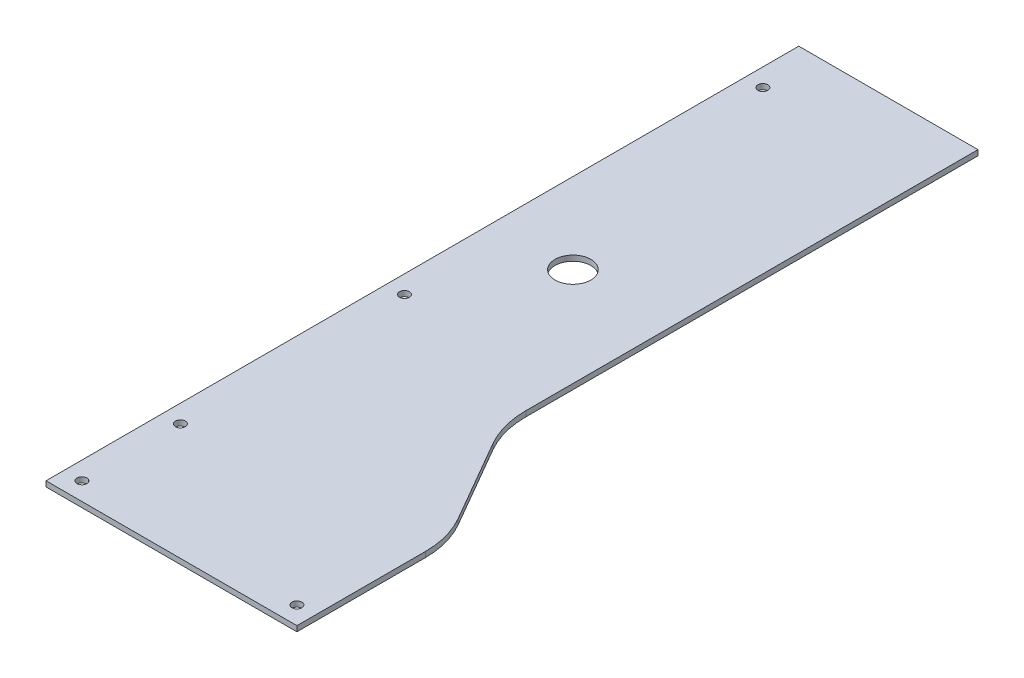
ISO-10303-21;
HEADER;
FILE_DESCRIPTION(('STEP AP214'),'2;1');
FILE_NAME('part.step','',(''),(''),'','','');
FILE_SCHEMA(('AUTOMOTIVE_DESIGN { 1 0 10303 214 1 1 1 1 }'));
ENDSEC;
DATA;
#1=APPLICATION_CONTEXT('core data for automotive mechanical design processes');
#2=APPLICATION_PROTOCOL_DEFINITION('international standard','automotive_design',2000,#1);
#3=PRODUCT_CONTEXT('',#1,'mechanical');
#4=PRODUCT('Part','Part','',(#3));
#5=PRODUCT_RELATED_PRODUCT_CATEGORY('part','',(#4));
#6=PRODUCT_DEFINITION_FORMATION('','',#4);
#7=PRODUCT_DEFINITION_CONTEXT('part definition',#1,'design');
#8=PRODUCT_DEFINITION('design','',#6,#7);
#9=PRODUCT_DEFINITION_SHAPE('','',#8);
#10=(LENGTH_UNIT() NAMED_UNIT(*) SI_UNIT(.MILLI.,.METRE.));
#11=(NAMED_UNIT(*) PLANE_ANGLE_UNIT() SI_UNIT($,.RADIAN.));
#12=(NAMED_UNIT(*) SI_UNIT($,.STERADIAN.) SOLID_ANGLE_UNIT());
#13=UNCERTAINTY_MEASURE_WITH_UNIT(LENGTH_MEASURE(1.E-05),#10,'distance_accuracy_value','');
#14=(GEOMETRIC_REPRESENTATION_CONTEXT(3) GLOBAL_UNCERTAINTY_ASSIGNED_CONTEXT((#13)) GLOBAL_UNIT_ASSIGNED_CONTEXT((#10,
#11,#12)) REPRESENTATION_CONTEXT('',''));
#15=CARTESIAN_POINT('',(0.,0.,0.));
#16=DIRECTION('',(0.,0.,1.));
#17=DIRECTION('',(1.,0.,0.));
#18=AXIS2_PLACEMENT_3D('',#15,#16,#17);
#19=CARTESIAN_POINT('',(204.268453609589,39.4297055458415,282.959032092008));
#20=DIRECTION('',(0.,1.,0.));
#21=DIRECTION('',(1.,0.,0.));
#22=AXIS2_PLACEMENT_3D('',#19,#20,#21);
#23=CYLINDRICAL_SURFACE('',#22,2.75);
#24=CARTESIAN_POINT('',(204.268453609589,39.4297055458415,282.959032092008));
#25=DIRECTION('',(0.,-1.,0.));
#26=DIRECTION('',(-1.,0.,0.));
#27=AXIS2_PLACEMENT_3D('',#24,#25,#26);
#28=CIRCLE('',#27,2.75);
#29=CARTESIAN_POINT('',(201.518453609589,39.4297055458415,282.959032092008));
#30=VERTEX_POINT('',#29);
#31=EDGE_CURVE('E194',#30,#30,#28,.T.);
#32=ORIENTED_EDGE('',*,*,#31,.T.);
#33=EDGE_LOOP('',(#32));
#34=FACE_BOUND('',#33,.T.);
#35=CARTESIAN_POINT('',(204.268453609589,42.4297055458415,282.959032092008));
#36=DIRECTION('',(0.,-1.,0.));
#37=DIRECTION('',(-1.,0.,0.));
#38=AXIS2_PLACEMENT_3D('',#35,#36,#37);
#39=CIRCLE('',#38,2.75);
#40=CARTESIAN_POINT('',(201.518453609589,42.4297055458415,282.959032092008));
#41=VERTEX_POINT('',#40);
#42=EDGE_CURVE('E198',#41,#41,#39,.T.);
#43=ORIENTED_EDGE('',*,*,#42,.F.);
#44=EDGE_LOOP('',(#43));
#45=FACE_BOUND('',#44,.T.);
#46=ADVANCED_FACE('F17',(#34,#45),#23,.F.);
#47=CARTESIAN_POINT('',(84.2684536095885,39.4297055458415,282.959032092008));
#48=DIRECTION('',(0.,1.,0.));
#49=DIRECTION('',(1.,0.,0.));
#50=AXIS2_PLACEMENT_3D('',#47,#48,#49);
#51=CYLINDRICAL_SURFACE('',#50,2.75);
#52=CARTESIAN_POINT('',(84.2684536095885,39.4297055458415,282.959032092008));
#53=DIRECTION('',(0.,-1.,0.));
#54=DIRECTION('',(-1.,0.,0.));
#55=AXIS2_PLACEMENT_3D('',#52,#53,#54);
#56=CIRCLE('',#55,2.75);
#57=CARTESIAN_POINT('',(81.5184536095885,39.4297055458415,282.959032092008));
#58=VERTEX_POINT('',#57);
#59=EDGE_CURVE('E186',#58,#58,#56,.T.);
#60=ORIENTED_EDGE('',*,*,#59,.T.);
#61=EDGE_LOOP('',(#60));
#62=FACE_BOUND('',#61,.T.);
#63=CARTESIAN_POINT('',(84.2684536095885,42.4297055458415,282.959032092008));
#64=DIRECTION('',(0.,-1.,0.));
#65=DIRECTION('',(-1.,0.,0.));
#66=AXIS2_PLACEMENT_3D('',#63,#64,#65);
#67=CIRCLE('',#66,2.75);
#68=CARTESIAN_POINT('',(81.5184536095885,42.4297055458415,282.959032092008));
#69=VERTEX_POINT('',#68);
#70=EDGE_CURVE('E190',#69,#69,#67,.T.);
#71=ORIENTED_EDGE('',*,*,#70,.F.);
#72=EDGE_LOOP('',(#71));
#73=FACE_BOUND('',#72,.T.);
#74=ADVANCED_FACE('F236',(#62,#73),#51,.F.);
#75=CARTESIAN_POINT('',(84.2684536095885,39.4297055458415,227.959032092009));
#76=DIRECTION('',(0.,1.,0.));
#77=DIRECTION('',(1.,0.,0.));
#78=AXIS2_PLACEMENT_3D('',#75,#76,#77);
#79=CYLINDRICAL_SURFACE('',#78,2.75);
#80=CARTESIAN_POINT('',(84.2684536095885,39.4297055458415,227.959032092009));
#81=DIRECTION('',(0.,-1.,0.));
#82=DIRECTION('',(-1.,0.,0.));
#83=AXIS2_PLACEMENT_3D('',#80,#81,#82);
#84=CIRCLE('',#83,2.75);
#85=CARTESIAN_POINT('',(81.5184536095885,39.4297055458415,227.959032092009));
#86=VERTEX_POINT('',#85);
#87=EDGE_CURVE('E178',#86,#86,#84,.T.);
#88=ORIENTED_EDGE('',*,*,#87,.T.);
#89=EDGE_LOOP('',(#88));
#90=FACE_BOUND('',#89,.T.);
#91=CARTESIAN_POINT('',(84.2684536095885,42.4297055458415,227.959032092009));
#92=DIRECTION('',(0.,-1.,0.));
#93=DIRECTION('',(-1.,0.,0.));
#94=AXIS2_PLACEMENT_3D('',#91,#92,#93);
#95=CIRCLE('',#94,2.75);
#96=CARTESIAN_POINT('',(81.5184536095885,42.4297055458415,227.959032092009));
#97=VERTEX_POINT('',#96);
#98=EDGE_CURVE('E182',#97,#97,#95,.T.);
#99=ORIENTED_EDGE('',*,*,#98,.F.);
#100=EDGE_LOOP('',(#99));
#101=FACE_BOUND('',#100,.T.);
#102=ADVANCED_FACE('F233',(#90,#101),#79,.F.);
#103=CARTESIAN_POINT('',(84.2684536095885,39.4297055458415,102.959032092009));
#104=DIRECTION('',(0.,1.,0.));
#105=DIRECTION('',(1.,0.,0.));
#106=AXIS2_PLACEMENT_3D('',#103,#104,#105);
#107=CYLINDRICAL_SURFACE('',#106,2.75);
#108=CARTESIAN_POINT('',(84.2684536095885,39.4297055458415,102.959032092009));
#109=DIRECTION('',(0.,-1.,0.));
#110=DIRECTION('',(-1.,0.,0.));
#111=AXIS2_PLACEMENT_3D('',#108,#109,#110);
#112=CIRCLE('',#111,2.75);
#113=CARTESIAN_POINT('',(81.5184536095885,39.4297055458415,102.959032092009));
#114=VERTEX_POINT('',#113);
#115=EDGE_CURVE('E170',#114,#114,#112,.T.);
#116=ORIENTED_EDGE('',*,*,#115,.T.);
#117=EDGE_LOOP('',(#116));
#118=FACE_BOUND('',#117,.T.);
#119=CARTESIAN_POINT('',(84.2684536095885,42.4297055458415,102.959032092009));
#120=DIRECTION('',(0.,-1.,0.));
#121=DIRECTION('',(-1.,0.,0.));
#122=AXIS2_PLACEMENT_3D('',#119,#120,#121);
#123=CIRCLE('',#122,2.75);
#124=CARTESIAN_POINT('',(81.5184536095885,42.4297055458415,102.959032092009));
#125=VERTEX_POINT('',#124);
#126=EDGE_CURVE('E174',#125,#125,#123,.T.);
#127=ORIENTED_EDGE('',*,*,#126,.F.);
#128=EDGE_LOOP('',(#127));
#129=FACE_BOUND('',#128,.T.);
#130=ADVANCED_FACE('F235',(#118,#129),#107,.F.);
#131=CARTESIAN_POINT('',(84.2684536095885,39.4297055458415,-97.0409679079914));
#132=DIRECTION('',(0.,1.,0.));
#133=DIRECTION('',(1.,0.,0.));
#134=AXIS2_PLACEMENT_3D('',#131,#132,#133);
#135=CYLINDRICAL_SURFACE('',#134,2.75000000000004);
#136=CARTESIAN_POINT('',(84.2684536095885,39.4297055458415,-97.0409679079914));
#137=DIRECTION('',(0.,-1.,0.));
#138=DIRECTION('',(-1.,0.,0.));
#139=AXIS2_PLACEMENT_3D('',#136,#137,#138);
#140=CIRCLE('',#139,2.75000000000004);
#141=CARTESIAN_POINT('',(81.5184536095885,39.4297055458415,-97.0409679079914));
#142=VERTEX_POINT('',#141);
#143=EDGE_CURVE('E150',#142,#142,#140,.T.);
#144=ORIENTED_EDGE('',*,*,#143,.T.);
#145=EDGE_LOOP('',(#144));
#146=FACE_BOUND('',#145,.T.);
#147=CARTESIAN_POINT('',(84.2684536095885,42.4297055458415,-97.0409679079914));
#148=DIRECTION('',(0.,-1.,0.));
#149=DIRECTION('',(-1.,0.,0.));
#150=AXIS2_PLACEMENT_3D('',#147,#148,#149);
#151=CIRCLE('',#150,2.75000000000004);
#152=CARTESIAN_POINT('',(81.5184536095885,42.4297055458415,-97.0409679079914));
#153=VERTEX_POINT('',#152);
#154=EDGE_CURVE('E166',#153,#153,#151,.T.);
#155=ORIENTED_EDGE('',*,*,#154,.F.);
#156=EDGE_LOOP('',(#155));
#157=FACE_BOUND('',#156,.T.);
#158=ADVANCED_FACE('F245',(#146,#157),#135,.F.);
#159=CARTESIAN_POINT('',(214.268453609588,39.4297055458415,292.959032092008));
#160=DIRECTION('',(0.,0.,-1.));
#161=DIRECTION('',(1.,0.,0.));
#162=AXIS2_PLACEMENT_3D('',#159,#160,#161);
#163=PLANE('',#162);
#164=DIRECTION('',(0.,1.,0.));
#165=VECTOR('',#164,1.);
#166=CARTESIAN_POINT('',(214.268453609588,39.4297055458415,292.959032092008));
#167=LINE('',#166,#165);
#168=CARTESIAN_POINT('',(214.268453609588,39.4297055458415,292.959032092008));
#169=VERTEX_POINT('',#168);
#170=CARTESIAN_POINT('',(214.268453609588,42.4297055458415,292.959032092008));
#171=VERTEX_POINT('',#170);
#172=EDGE_CURVE('E124',#169,#171,#167,.T.);
#173=ORIENTED_EDGE('',*,*,#172,.T.);
#174=DIRECTION('',(-1.,0.,0.));
#175=VECTOR('',#174,1.);
#176=CARTESIAN_POINT('',(214.268453609588,42.4297055458415,292.959032092008));
#177=LINE('',#176,#175);
#178=CARTESIAN_POINT('',(74.2684536095886,42.4297055458415,292.959032092008));
#179=VERTEX_POINT('',#178);
#180=EDGE_CURVE('E11',#171,#179,#177,.T.);
#181=ORIENTED_EDGE('',*,*,#180,.T.);
#182=DIRECTION('',(0.,1.,0.));
#183=VECTOR('',#182,1.);
#184=CARTESIAN_POINT('',(74.2684536095886,39.4297055458415,292.959032092008));
#185=LINE('',#184,#183);
#186=CARTESIAN_POINT('',(74.2684536095886,39.4297055458415,292.959032092008));
#187=VERTEX_POINT('',#186);
#188=EDGE_CURVE('E128',#187,#179,#185,.T.);
#189=ORIENTED_EDGE('',*,*,#188,.F.);
#190=DIRECTION('',(-1.,0.,0.));
#191=VECTOR('',#190,1.);
#192=CARTESIAN_POINT('',(214.268453609588,39.4297055458415,292.959032092008));
#193=LINE('',#192,#191);
#194=EDGE_CURVE('E95',#169,#187,#193,.T.);
#195=ORIENTED_EDGE('',*,*,#194,.F.);
#196=EDGE_LOOP('',(#173,#181,#189,#195));
#197=FACE_BOUND('',#196,.T.);
#198=ADVANCED_FACE('F19',(#197),#163,.F.);
#199=CARTESIAN_POINT('',(214.268453609588,39.4297055458415,221.356491713565));
#200=DIRECTION('',(-1.,0.,0.));
#201=DIRECTION('',(0.,0.,-1.));
#202=AXIS2_PLACEMENT_3D('',#199,#200,#201);
#203=PLANE('',#202);
#204=DIRECTION('',(0.,0.,1.));
#205=VECTOR('',#204,1.);
#206=CARTESIAN_POINT('',(214.268453609588,42.4297055458415,221.356491713565));
#207=LINE('',#206,#205);
#208=CARTESIAN_POINT('',(214.268453609588,42.4297055458415,221.356491713565));
#209=VERTEX_POINT('',#208);
#210=EDGE_CURVE('E98',#209,#171,#207,.T.);
#211=ORIENTED_EDGE('',*,*,#210,.T.);
#212=ORIENTED_EDGE('',*,*,#172,.F.);
#213=DIRECTION('',(0.,0.,1.));
#214=VECTOR('',#213,1.);
#215=CARTESIAN_POINT('',(214.268453609588,39.4297055458415,221.356491713565));
#216=LINE('',#215,#214);
#217=CARTESIAN_POINT('',(214.268453609588,39.4297055458415,221.356491713565));
#218=VERTEX_POINT('',#217);
#219=EDGE_CURVE('E153',#218,#169,#216,.T.);
#220=ORIENTED_EDGE('',*,*,#219,.F.);
#221=DIRECTION('',(0.,1.,0.));
#222=VECTOR('',#221,1.);
#223=CARTESIAN_POINT('',(214.268453609588,39.4297055458415,221.356491713565));
#224=LINE('',#223,#222);
#225=EDGE_CURVE('E120',#218,#209,#224,.T.);
#226=ORIENTED_EDGE('',*,*,#225,.T.);
#227=EDGE_LOOP('',(#211,#212,#220,#226));
#228=FACE_BOUND('',#227,.T.);
#229=ADVANCED_FACE('F261',(#228),#203,.F.);
#230=CARTESIAN_POINT('',(164.268453609589,39.4297055458415,221.356491713565));
#231=DIRECTION('',(0.,1.,0.));
#232=DIRECTION('',(1.,0.,0.));
#233=AXIS2_PLACEMENT_3D('',#230,#231,#232);
#234=CYLINDRICAL_SURFACE('',#233,50.);
#235=CARTESIAN_POINT('',(164.268453609589,42.4297055458415,221.356491713565));
#236=DIRECTION('',(0.,-1.,0.));
#237=DIRECTION('',(1.,0.,0.));
#238=AXIS2_PLACEMENT_3D('',#235,#236,#237);
#239=CIRCLE('',#238,50.);
#240=CARTESIAN_POINT('',(207.56972379881,42.4297055458415,196.356491713565));
#241=VERTEX_POINT('',#240);
#242=EDGE_CURVE('E134',#241,#209,#239,.T.);
#243=ORIENTED_EDGE('',*,*,#242,.T.);
#244=ORIENTED_EDGE('',*,*,#225,.F.);
#245=CARTESIAN_POINT('',(164.268453609589,39.4297055458415,221.356491713565));
#246=DIRECTION('',(0.,-1.,0.));
#247=DIRECTION('',(1.,0.,0.));
#248=AXIS2_PLACEMENT_3D('',#245,#246,#247);
#249=CIRCLE('',#248,50.);
#250=CARTESIAN_POINT('',(207.56972379881,39.4297055458415,196.356491713565));
#251=VERTEX_POINT('',#250);
#252=EDGE_CURVE('E156',#251,#218,#249,.T.);
#253=ORIENTED_EDGE('',*,*,#252,.F.);
#254=DIRECTION('',(0.,1.,0.));
#255=VECTOR('',#254,1.);
#256=CARTESIAN_POINT('',(207.56972379881,39.4297055458415,196.356491713565));
#257=LINE('',#256,#255);
#258=EDGE_CURVE('E116',#251,#241,#257,.T.);
#259=ORIENTED_EDGE('',*,*,#258,.T.);
#260=EDGE_LOOP('',(#243,#244,#253,#259));
#261=FACE_BOUND('',#260,.T.);
#262=ADVANCED_FACE('F257',(#261),#234,.T.);
#263=CARTESIAN_POINT('',(180.967183420366,39.4297055458415,150.279540167697));
#264=DIRECTION('',(-0.866025403784438,0.,0.5));
#265=DIRECTION('',(-0.5,0.,-0.866025403784438));
#266=AXIS2_PLACEMENT_3D('',#263,#264,#265);
#267=PLANE('',#266);
#268=DIRECTION('',(0.5,0.,0.866025403784438));
#269=VECTOR('',#268,1.);
#270=CARTESIAN_POINT('',(180.967183420366,42.4297055458415,150.279540167697));
#271=LINE('',#270,#269);
#272=CARTESIAN_POINT('',(180.967183420366,42.4297055458415,150.279540167697));
#273=VERTEX_POINT('',#272);
#274=EDGE_CURVE('E137',#273,#241,#271,.T.);
#275=ORIENTED_EDGE('',*,*,#274,.T.);
#276=ORIENTED_EDGE('',*,*,#258,.F.);
#277=DIRECTION('',(0.5,0.,0.866025403784438));
#278=VECTOR('',#277,1.);
#279=CARTESIAN_POINT('',(180.967183420366,39.4297055458415,150.279540167697));
#280=LINE('',#279,#278);
#281=CARTESIAN_POINT('',(180.967183420366,39.4297055458415,150.279540167697));
#282=VERTEX_POINT('',#281);
#283=EDGE_CURVE('E159',#282,#251,#280,.T.);
#284=ORIENTED_EDGE('',*,*,#283,.F.);
#285=DIRECTION('',(0.,1.,0.));
#286=VECTOR('',#285,1.);
#287=CARTESIAN_POINT('',(180.967183420366,39.4297055458415,150.279540167697));
#288=LINE('',#287,#286);
#289=EDGE_CURVE('E113',#282,#273,#288,.T.);
#290=ORIENTED_EDGE('',*,*,#289,.T.);
#291=EDGE_LOOP('',(#275,#276,#284,#290));
#292=FACE_BOUND('',#291,.T.);
#293=ADVANCED_FACE('F260',(#292),#267,.F.);
#294=CARTESIAN_POINT('',(224.268453609589,39.4297055458415,125.279540167697));
#295=DIRECTION('',(0.,1.,0.));
#296=DIRECTION('',(1.,0.,0.));
#297=AXIS2_PLACEMENT_3D('',#294,#295,#296);
#298=CYLINDRICAL_SURFACE('',#297,50.);
#299=CARTESIAN_POINT('',(224.268453609589,42.4297055458415,125.279540167697));
#300=DIRECTION('',(0.,1.,0.));
#301=DIRECTION('',(-1.,0.,0.));
#302=AXIS2_PLACEMENT_3D('',#299,#300,#301);
#303=CIRCLE('',#302,50.);
#304=CARTESIAN_POINT('',(174.268453609589,42.4297055458415,125.279540167698));
#305=VERTEX_POINT('',#304);
#306=EDGE_CURVE('E140',#305,#273,#303,.T.);
#307=ORIENTED_EDGE('',*,*,#306,.T.);
#308=ORIENTED_EDGE('',*,*,#289,.F.);
#309=CARTESIAN_POINT('',(224.268453609589,39.4297055458415,125.279540167697));
#310=DIRECTION('',(0.,1.,0.));
#311=DIRECTION('',(-1.,0.,0.));
#312=AXIS2_PLACEMENT_3D('',#309,#310,#311);
#313=CIRCLE('',#312,50.);
#314=CARTESIAN_POINT('',(174.268453609589,39.4297055458415,125.279540167698));
#315=VERTEX_POINT('',#314);
#316=EDGE_CURVE('E162',#315,#282,#313,.T.);
#317=ORIENTED_EDGE('',*,*,#316,.F.);
#318=DIRECTION('',(0.,1.,0.));
#319=VECTOR('',#318,1.);
#320=CARTESIAN_POINT('',(174.268453609589,39.4297055458415,125.279540167698));
#321=LINE('',#320,#319);
#322=EDGE_CURVE('E107',#315,#305,#321,.T.);
#323=ORIENTED_EDGE('',*,*,#322,.T.);
#324=EDGE_LOOP('',(#307,#308,#317,#323));
#325=FACE_BOUND('',#324,.T.);
#326=ADVANCED_FACE('F265',(#325),#298,.F.);
#327=CARTESIAN_POINT('',(174.268453609589,39.4297055458415,-127.040967907991));
#328=DIRECTION('',(-1.,0.,0.));
#329=DIRECTION('',(0.,0.,-1.));
#330=AXIS2_PLACEMENT_3D('',#327,#328,#329);
#331=PLANE('',#330);
#332=DIRECTION('',(0.,0.,1.));
#333=VECTOR('',#332,1.);
#334=CARTESIAN_POINT('',(174.268453609589,42.4297055458415,-127.040967907991));
#335=LINE('',#334,#333);
#336=CARTESIAN_POINT('',(174.268453609589,42.4297055458415,-127.040967907991));
#337=VERTEX_POINT('',#336);
#338=EDGE_CURVE('E143',#337,#305,#335,.T.);
#339=ORIENTED_EDGE('',*,*,#338,.T.);
#340=ORIENTED_EDGE('',*,*,#322,.F.);
#341=DIRECTION('',(0.,0.,1.));
#342=VECTOR('',#341,1.);
#343=CARTESIAN_POINT('',(174.268453609589,39.4297055458415,-127.040967907991));
#344=LINE('',#343,#342);
#345=CARTESIAN_POINT('',(174.268453609589,39.4297055458415,-127.040967907991));
#346=VERTEX_POINT('',#345);
#347=EDGE_CURVE('E88',#346,#315,#344,.T.);
#348=ORIENTED_EDGE('',*,*,#347,.F.);
#349=DIRECTION('',(0.,1.,0.));
#350=VECTOR('',#349,1.);
#351=CARTESIAN_POINT('',(174.268453609589,39.4297055458415,-127.040967907991));
#352=LINE('',#351,#350);
#353=EDGE_CURVE('E84',#346,#337,#352,.T.);
#354=ORIENTED_EDGE('',*,*,#353,.T.);
#355=EDGE_LOOP('',(#339,#340,#348,#354));
#356=FACE_BOUND('',#355,.T.);
#357=ADVANCED_FACE('F269',(#356),#331,.F.);
#358=CARTESIAN_POINT('',(74.2684536095886,39.4297055458415,-127.040967907991));
#359=DIRECTION('',(0.,0.,1.));
#360=DIRECTION('',(-1.,0.,0.));
#361=AXIS2_PLACEMENT_3D('',#358,#359,#360);
#362=PLANE('',#361);
#363=DIRECTION('',(1.,0.,0.));
#364=VECTOR('',#363,1.);
#365=CARTESIAN_POINT('',(74.2684536095886,42.4297055458415,-127.040967907991));
#366=LINE('',#365,#364);
#367=CARTESIAN_POINT('',(74.2684536095886,42.4297055458415,-127.040967907991));
#368=VERTEX_POINT('',#367);
#369=EDGE_CURVE('E146',#368,#337,#366,.T.);
#370=ORIENTED_EDGE('',*,*,#369,.T.);
#371=ORIENTED_EDGE('',*,*,#353,.F.);
#372=DIRECTION('',(1.,0.,0.));
#373=VECTOR('',#372,1.);
#374=CARTESIAN_POINT('',(74.2684536095886,39.4297055458415,-127.040967907991));
#375=LINE('',#374,#373);
#376=CARTESIAN_POINT('',(74.2684536095886,39.4297055458415,-127.040967907991));
#377=VERTEX_POINT('',#376);
#378=EDGE_CURVE('E79',#377,#346,#375,.T.);
#379=ORIENTED_EDGE('',*,*,#378,.F.);
#380=DIRECTION('',(0.,1.,0.));
#381=VECTOR('',#380,1.);
#382=CARTESIAN_POINT('',(74.2684536095886,39.4297055458415,-127.040967907991));
#383=LINE('',#382,#381);
#384=EDGE_CURVE('E27',#377,#368,#383,.T.);
#385=ORIENTED_EDGE('',*,*,#384,.T.);
#386=EDGE_LOOP('',(#370,#371,#379,#385));
#387=FACE_BOUND('',#386,.T.);
#388=ADVANCED_FACE('F81',(#387),#362,.F.);
#389=CARTESIAN_POINT('',(74.2684536095886,39.4297055458415,-7.04096790799141));
#390=DIRECTION('',(1.,0.,0.));
#391=DIRECTION('',(0.,-1.,0.));
#392=AXIS2_PLACEMENT_3D('',#389,#390,#391);
#393=PLANE('',#392);
#394=DIRECTION('',(0.,0.,-1.));
#395=VECTOR('',#394,1.);
#396=CARTESIAN_POINT('',(74.2684536095886,42.4297055458415,-7.04096790799141));
#397=LINE('',#396,#395);
#398=EDGE_CURVE('E33',#179,#368,#397,.T.);
#399=ORIENTED_EDGE('',*,*,#398,.T.);
#400=ORIENTED_EDGE('',*,*,#384,.F.);
#401=DIRECTION('',(0.,0.,-1.));
#402=VECTOR('',#401,1.);
#403=CARTESIAN_POINT('',(74.2684536095886,39.4297055458415,-7.04096790799141));
#404=LINE('',#403,#402);
#405=EDGE_CURVE('E89',#187,#377,#404,.T.);
#406=ORIENTED_EDGE('',*,*,#405,.F.);
#407=ORIENTED_EDGE('',*,*,#188,.T.);
#408=EDGE_LOOP('',(#399,#400,#406,#407));
#409=FACE_BOUND('',#408,.T.);
#410=ADVANCED_FACE('F100',(#409),#393,.F.);
#411=CARTESIAN_POINT('',(224.268453609589,39.4297055458415,125.279540167697));
#412=DIRECTION('',(0.,-1.,0.));
#413=DIRECTION('',(-1.,0.,0.));
#414=AXIS2_PLACEMENT_3D('',#411,#412,#413);
#415=PLANE('',#414);
#416=CARTESIAN_POINT('',(119.268453609589,39.4297055458415,43.9590320920183));
#417=DIRECTION('',(0.,1.,0.));
#418=DIRECTION('',(0.,0.,1.));
#419=AXIS2_PLACEMENT_3D('',#416,#417,#418);
#420=CIRCLE('',#419,10.);
#421=CARTESIAN_POINT('',(119.268453609589,39.4297055458415,53.9590320920183));
#422=VERTEX_POINT('',#421);
#423=EDGE_CURVE('E202',#422,#422,#420,.T.);
#424=ORIENTED_EDGE('',*,*,#423,.T.);
#425=EDGE_LOOP('',(#424));
#426=FACE_BOUND('',#425,.T.);
#427=ORIENTED_EDGE('',*,*,#194,.T.);
#428=ORIENTED_EDGE('',*,*,#405,.T.);
#429=ORIENTED_EDGE('',*,*,#378,.T.);
#430=ORIENTED_EDGE('',*,*,#347,.T.);
#431=ORIENTED_EDGE('',*,*,#316,.T.);
#432=ORIENTED_EDGE('',*,*,#283,.T.);
#433=ORIENTED_EDGE('',*,*,#252,.T.);
#434=ORIENTED_EDGE('',*,*,#219,.T.);
#435=EDGE_LOOP('',(#427,#428,#429,#430,#431,#432,#433,#434));
#436=FACE_BOUND('',#435,.T.);
#437=ORIENTED_EDGE('',*,*,#59,.F.);
#438=EDGE_LOOP('',(#437));
#439=FACE_BOUND('',#438,.T.);
#440=ORIENTED_EDGE('',*,*,#115,.F.);
#441=EDGE_LOOP('',(#440));
#442=FACE_BOUND('',#441,.T.);
#443=ORIENTED_EDGE('',*,*,#143,.F.);
#444=EDGE_LOOP('',(#443));
#445=FACE_BOUND('',#444,.T.);
#446=ORIENTED_EDGE('',*,*,#87,.F.);
#447=EDGE_LOOP('',(#446));
#448=FACE_BOUND('',#447,.T.);
#449=ORIENTED_EDGE('',*,*,#31,.F.);
#450=EDGE_LOOP('',(#449));
#451=FACE_BOUND('',#450,.T.);
#452=ADVANCED_FACE('F92',(#426,#436,#439,#442,#445,#448,#451),#415,.T.);
#453=CARTESIAN_POINT('',(224.268453609589,42.4297055458415,125.279540167697));
#454=DIRECTION('',(0.,-1.,0.));
#455=DIRECTION('',(-1.,0.,0.));
#456=AXIS2_PLACEMENT_3D('',#453,#454,#455);
#457=PLANE('',#456);
#458=CARTESIAN_POINT('',(119.268453609589,42.4297055458415,43.9590320920183));
#459=DIRECTION('',(0.,1.,0.));
#460=DIRECTION('',(0.,0.,1.));
#461=AXIS2_PLACEMENT_3D('',#458,#459,#460);
#462=CIRCLE('',#461,10.);
#463=CARTESIAN_POINT('',(119.268453609589,42.4297055458415,53.9590320920183));
#464=VERTEX_POINT('',#463);
#465=EDGE_CURVE('E206',#464,#464,#462,.T.);
#466=ORIENTED_EDGE('',*,*,#465,.F.);
#467=EDGE_LOOP('',(#466));
#468=FACE_BOUND('',#467,.T.);
#469=ORIENTED_EDGE('',*,*,#398,.F.);
#470=ORIENTED_EDGE('',*,*,#180,.F.);
#471=ORIENTED_EDGE('',*,*,#210,.F.);
#472=ORIENTED_EDGE('',*,*,#242,.F.);
#473=ORIENTED_EDGE('',*,*,#274,.F.);
#474=ORIENTED_EDGE('',*,*,#306,.F.);
#475=ORIENTED_EDGE('',*,*,#338,.F.);
#476=ORIENTED_EDGE('',*,*,#369,.F.);
#477=EDGE_LOOP('',(#469,#470,#471,#472,#473,#474,#475,#476));
#478=FACE_BOUND('',#477,.T.);
#479=ORIENTED_EDGE('',*,*,#42,.T.);
#480=EDGE_LOOP('',(#479));
#481=FACE_BOUND('',#480,.T.);
#482=ORIENTED_EDGE('',*,*,#70,.T.);
#483=EDGE_LOOP('',(#482));
#484=FACE_BOUND('',#483,.T.);
#485=ORIENTED_EDGE('',*,*,#154,.T.);
#486=EDGE_LOOP('',(#485));
#487=FACE_BOUND('',#486,.T.);
#488=ORIENTED_EDGE('',*,*,#126,.T.);
#489=EDGE_LOOP('',(#488));
#490=FACE_BOUND('',#489,.T.);
#491=ORIENTED_EDGE('',*,*,#98,.T.);
#492=EDGE_LOOP('',(#491));
#493=FACE_BOUND('',#492,.T.);
#494=ADVANCED_FACE('F216',(#468,#478,#481,#484,#487,#490,#493),#457,.F.);
#495=CARTESIAN_POINT('',(119.268453609589,39.4297055458415,43.9590320920183));
#496=DIRECTION('',(0.,1.,0.));
#497=DIRECTION('',(0.,0.,1.));
#498=AXIS2_PLACEMENT_3D('',#495,#496,#497);
#499=CYLINDRICAL_SURFACE('',#498,10.);
#500=ORIENTED_EDGE('',*,*,#423,.F.);
#501=EDGE_LOOP('',(#500));
#502=FACE_BOUND('',#501,.T.);
#503=ORIENTED_EDGE('',*,*,#465,.T.);
#504=EDGE_LOOP('',(#503));
#505=FACE_BOUND('',#504,.T.);
#506=ADVANCED_FACE('F213',(#502,#505),#499,.F.);
#507=CLOSED_SHELL('',(#46,#74,#102,#130,#158,#198,#229,#262,#293,#326,#357,#388,#410,#452,#494,#506));
#508=MANIFOLD_SOLID_BREP('B1',#507);
#509=ADVANCED_BREP_SHAPE_REPRESENTATION('',(#18,#508),#14);
#510=SHAPE_DEFINITION_REPRESENTATION(#9,#509);
ENDSEC;
END-ISO-10303-21;
